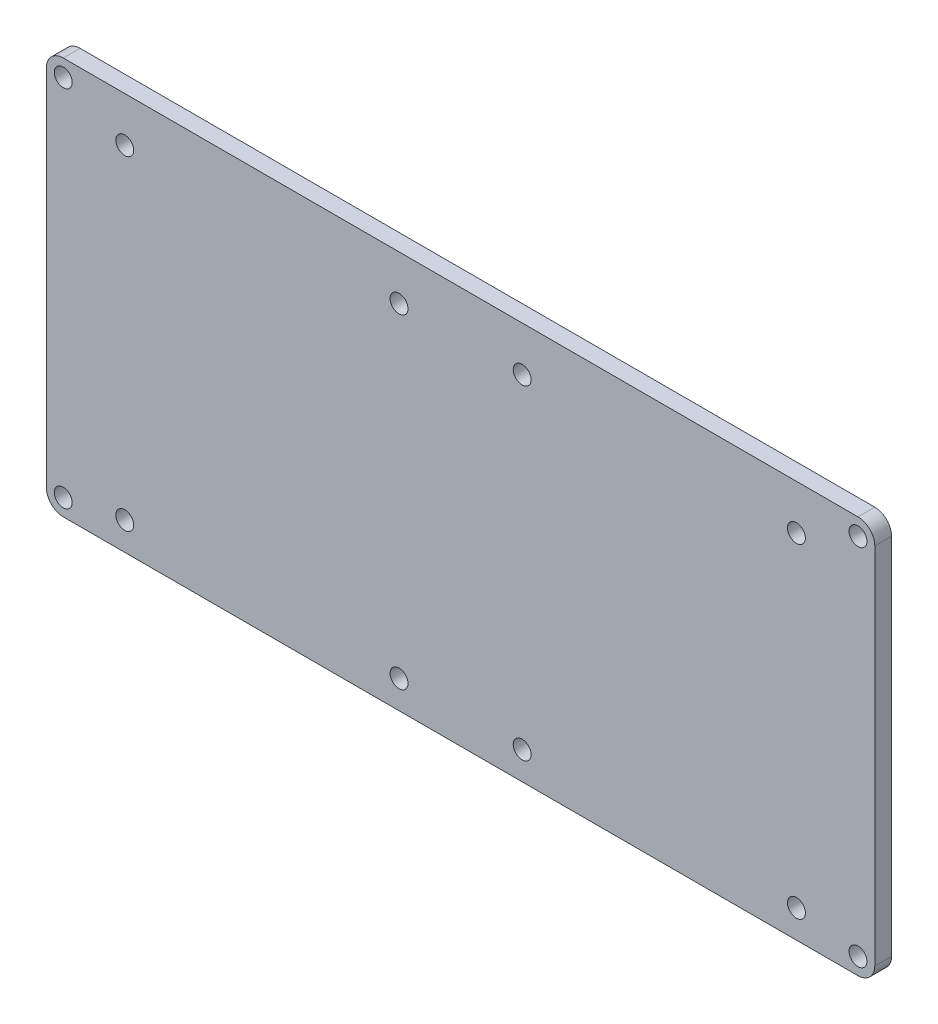
ISO-10303-21;
HEADER;
FILE_DESCRIPTION(('STEP AP214'),'2;1');
FILE_NAME('part.step','',(''),(''),'','','');
FILE_SCHEMA(('AUTOMOTIVE_DESIGN { 1 0 10303 214 1 1 1 1 }'));
ENDSEC;
DATA;
#1=APPLICATION_CONTEXT('core data for automotive mechanical design processes');
#2=APPLICATION_PROTOCOL_DEFINITION('international standard','automotive_design',2000,#1);
#3=PRODUCT_CONTEXT('',#1,'mechanical');
#4=PRODUCT('Part','Part','',(#3));
#5=PRODUCT_RELATED_PRODUCT_CATEGORY('part','',(#4));
#6=PRODUCT_DEFINITION_FORMATION('','',#4);
#7=PRODUCT_DEFINITION_CONTEXT('part definition',#1,'design');
#8=PRODUCT_DEFINITION('design','',#6,#7);
#9=PRODUCT_DEFINITION_SHAPE('','',#8);
#10=(LENGTH_UNIT() NAMED_UNIT(*) SI_UNIT(.MILLI.,.METRE.));
#11=(NAMED_UNIT(*) PLANE_ANGLE_UNIT() SI_UNIT($,.RADIAN.));
#12=(NAMED_UNIT(*) SI_UNIT($,.STERADIAN.) SOLID_ANGLE_UNIT());
#13=UNCERTAINTY_MEASURE_WITH_UNIT(LENGTH_MEASURE(1.E-05),#10,'distance_accuracy_value','');
#14=(GEOMETRIC_REPRESENTATION_CONTEXT(3) GLOBAL_UNCERTAINTY_ASSIGNED_CONTEXT((#13)) GLOBAL_UNIT_ASSIGNED_CONTEXT((#10,
#11,#12)) REPRESENTATION_CONTEXT('',''));
#15=CARTESIAN_POINT('',(0.,0.,0.));
#16=DIRECTION('',(0.,0.,1.));
#17=DIRECTION('',(1.,0.,0.));
#18=AXIS2_PLACEMENT_3D('',#15,#16,#17);
#19=CARTESIAN_POINT('',(3.,3.,3.));
#20=DIRECTION('',(0.,0.,1.));
#21=DIRECTION('',(1.,0.,0.));
#22=AXIS2_PLACEMENT_3D('',#19,#20,#21);
#23=PLANE('',#22);
#24=CARTESIAN_POINT('',(133.999999999999,5.,3.));
#25=DIRECTION('',(0.,0.,1.));
#26=DIRECTION('',(-1.,0.,0.));
#27=AXIS2_PLACEMENT_3D('',#24,#25,#26);
#28=CIRCLE('',#27,1.59999999999999);
#29=CARTESIAN_POINT('',(132.399999999999,5.,3.));
#30=VERTEX_POINT('',#29);
#31=EDGE_CURVE('E236',#30,#30,#28,.T.);
#32=ORIENTED_EDGE('',*,*,#31,.F.);
#33=EDGE_LOOP('',(#32));
#34=FACE_BOUND('',#33,.T.);
#35=CARTESIAN_POINT('',(85.,63.,3.));
#36=DIRECTION('',(0.,0.,1.));
#37=DIRECTION('',(-1.,0.,0.));
#38=AXIS2_PLACEMENT_3D('',#35,#36,#37);
#39=CIRCLE('',#38,1.60000000000001);
#40=CARTESIAN_POINT('',(83.4,63.,3.));
#41=VERTEX_POINT('',#40);
#42=EDGE_CURVE('E224',#41,#41,#39,.T.);
#43=ORIENTED_EDGE('',*,*,#42,.F.);
#44=EDGE_LOOP('',(#43));
#45=FACE_BOUND('',#44,.T.);
#46=CARTESIAN_POINT('',(63.0000000000006,5.,3.));
#47=DIRECTION('',(0.,0.,1.));
#48=DIRECTION('',(1.,0.,0.));
#49=AXIS2_PLACEMENT_3D('',#46,#47,#48);
#50=CIRCLE('',#49,1.60000000000001);
#51=CARTESIAN_POINT('',(64.6000000000006,5.,3.));
#52=VERTEX_POINT('',#51);
#53=EDGE_CURVE('E212',#52,#52,#50,.T.);
#54=ORIENTED_EDGE('',*,*,#53,.F.);
#55=EDGE_LOOP('',(#54));
#56=FACE_BOUND('',#55,.T.);
#57=CARTESIAN_POINT('',(2.99999999999978,68.,3.));
#58=DIRECTION('',(0.,0.,1.));
#59=DIRECTION('',(1.,0.,0.));
#60=AXIS2_PLACEMENT_3D('',#57,#58,#59);
#61=CIRCLE('',#60,1.6);
#62=CARTESIAN_POINT('',(4.59999999999977,68.,3.));
#63=VERTEX_POINT('',#62);
#64=EDGE_CURVE('E200',#63,#63,#61,.T.);
#65=ORIENTED_EDGE('',*,*,#64,.F.);
#66=EDGE_LOOP('',(#65));
#67=FACE_BOUND('',#66,.T.);
#68=CARTESIAN_POINT('',(145.,3.,3.));
#69=DIRECTION('',(0.,0.,1.));
#70=DIRECTION('',(1.,0.,0.));
#71=AXIS2_PLACEMENT_3D('',#68,#69,#70);
#72=CIRCLE('',#71,1.59999999999999);
#73=CARTESIAN_POINT('',(146.6,3.,3.));
#74=VERTEX_POINT('',#73);
#75=EDGE_CURVE('E188',#74,#74,#72,.T.);
#76=ORIENTED_EDGE('',*,*,#75,.F.);
#77=EDGE_LOOP('',(#76));
#78=FACE_BOUND('',#77,.T.);
#79=CARTESIAN_POINT('',(3.,3.,3.));
#80=DIRECTION('',(0.,0.,1.));
#81=DIRECTION('',(1.,0.,0.));
#82=AXIS2_PLACEMENT_3D('',#79,#80,#81);
#83=CIRCLE('',#82,1.6);
#84=CARTESIAN_POINT('',(4.6,3.,3.));
#85=VERTEX_POINT('',#84);
#86=EDGE_CURVE('E134',#85,#85,#83,.T.);
#87=ORIENTED_EDGE('',*,*,#86,.F.);
#88=EDGE_LOOP('',(#87));
#89=FACE_BOUND('',#88,.T.);
#90=CARTESIAN_POINT('',(3.,3.,3.));
#91=DIRECTION('',(0.,0.,1.));
#92=DIRECTION('',(1.,0.,0.));
#93=AXIS2_PLACEMENT_3D('',#90,#91,#92);
#94=CIRCLE('',#93,3.);
#95=CARTESIAN_POINT('',(0.,3.00000000000002,3.));
#96=VERTEX_POINT('',#95);
#97=CARTESIAN_POINT('',(3.00000000000002,0.,3.));
#98=VERTEX_POINT('',#97);
#99=EDGE_CURVE('E145',#96,#98,#94,.T.);
#100=ORIENTED_EDGE('',*,*,#99,.T.);
#101=DIRECTION('',(1.,0.,0.));
#102=VECTOR('',#101,1.);
#103=CARTESIAN_POINT('',(3.00000000000002,0.,3.));
#104=LINE('',#103,#102);
#105=CARTESIAN_POINT('',(145.,0.,3.));
#106=VERTEX_POINT('',#105);
#107=EDGE_CURVE('E93',#98,#106,#104,.T.);
#108=ORIENTED_EDGE('',*,*,#107,.T.);
#109=CARTESIAN_POINT('',(145.,3.,3.));
#110=DIRECTION('',(0.,0.,1.));
#111=DIRECTION('',(1.,0.,0.));
#112=AXIS2_PLACEMENT_3D('',#109,#110,#111);
#113=CIRCLE('',#112,3.);
#114=CARTESIAN_POINT('',(148.,3.00000000000002,3.));
#115=VERTEX_POINT('',#114);
#116=EDGE_CURVE('E160',#106,#115,#113,.T.);
#117=ORIENTED_EDGE('',*,*,#116,.T.);
#118=DIRECTION('',(0.,1.,0.));
#119=VECTOR('',#118,1.);
#120=CARTESIAN_POINT('',(148.,3.00000000000002,3.));
#121=LINE('',#120,#119);
#122=CARTESIAN_POINT('',(148.,68.,3.));
#123=VERTEX_POINT('',#122);
#124=EDGE_CURVE('E173',#115,#123,#121,.T.);
#125=ORIENTED_EDGE('',*,*,#124,.T.);
#126=CARTESIAN_POINT('',(145.,68.,3.));
#127=DIRECTION('',(0.,0.,1.));
#128=DIRECTION('',(1.,0.,0.));
#129=AXIS2_PLACEMENT_3D('',#126,#127,#128);
#130=CIRCLE('',#129,3.);
#131=CARTESIAN_POINT('',(145.,71.,3.));
#132=VERTEX_POINT('',#131);
#133=EDGE_CURVE('E112',#123,#132,#130,.T.);
#134=ORIENTED_EDGE('',*,*,#133,.T.);
#135=DIRECTION('',(-1.,0.,0.));
#136=VECTOR('',#135,1.);
#137=CARTESIAN_POINT('',(3.00000000000002,71.,3.));
#138=LINE('',#137,#136);
#139=CARTESIAN_POINT('',(3.00000000000002,71.,3.));
#140=VERTEX_POINT('',#139);
#141=EDGE_CURVE('E106',#132,#140,#138,.T.);
#142=ORIENTED_EDGE('',*,*,#141,.T.);
#143=CARTESIAN_POINT('',(3.,68.,3.));
#144=DIRECTION('',(0.,0.,1.));
#145=DIRECTION('',(1.,0.,0.));
#146=AXIS2_PLACEMENT_3D('',#143,#144,#145);
#147=CIRCLE('',#146,3.);
#148=CARTESIAN_POINT('',(0.,68.,3.));
#149=VERTEX_POINT('',#148);
#150=EDGE_CURVE('E110',#140,#149,#147,.T.);
#151=ORIENTED_EDGE('',*,*,#150,.T.);
#152=DIRECTION('',(0.,-1.,0.));
#153=VECTOR('',#152,1.);
#154=CARTESIAN_POINT('',(0.,3.00000000000002,3.));
#155=LINE('',#154,#153);
#156=EDGE_CURVE('E50',#149,#96,#155,.T.);
#157=ORIENTED_EDGE('',*,*,#156,.T.);
#158=EDGE_LOOP('',(#100,#108,#117,#125,#134,#142,#151,#157));
#159=FACE_BOUND('',#158,.T.);
#160=CARTESIAN_POINT('',(14.,63.,3.));
#161=DIRECTION('',(0.,0.,1.));
#162=DIRECTION('',(1.,0.,0.));
#163=AXIS2_PLACEMENT_3D('',#160,#161,#162);
#164=CIRCLE('',#163,1.6);
#165=CARTESIAN_POINT('',(15.6,63.,3.));
#166=VERTEX_POINT('',#165);
#167=EDGE_CURVE('E182',#166,#166,#164,.T.);
#168=ORIENTED_EDGE('',*,*,#167,.F.);
#169=EDGE_LOOP('',(#168));
#170=FACE_BOUND('',#169,.T.);
#171=CARTESIAN_POINT('',(145.,68.,3.));
#172=DIRECTION('',(0.,0.,1.));
#173=DIRECTION('',(1.,0.,0.));
#174=AXIS2_PLACEMENT_3D('',#171,#172,#173);
#175=CIRCLE('',#174,1.59999999999999);
#176=CARTESIAN_POINT('',(146.6,68.,3.));
#177=VERTEX_POINT('',#176);
#178=EDGE_CURVE('E194',#177,#177,#175,.T.);
#179=ORIENTED_EDGE('',*,*,#178,.F.);
#180=EDGE_LOOP('',(#179));
#181=FACE_BOUND('',#180,.T.);
#182=CARTESIAN_POINT('',(63.,63.,3.));
#183=DIRECTION('',(0.,0.,1.));
#184=DIRECTION('',(1.,0.,0.));
#185=AXIS2_PLACEMENT_3D('',#182,#183,#184);
#186=CIRCLE('',#185,1.60000000000001);
#187=CARTESIAN_POINT('',(64.6,63.,3.));
#188=VERTEX_POINT('',#187);
#189=EDGE_CURVE('E206',#188,#188,#186,.T.);
#190=ORIENTED_EDGE('',*,*,#189,.F.);
#191=EDGE_LOOP('',(#190));
#192=FACE_BOUND('',#191,.T.);
#193=CARTESIAN_POINT('',(14.0000000000006,5.,3.));
#194=DIRECTION('',(0.,0.,1.));
#195=DIRECTION('',(1.,0.,0.));
#196=AXIS2_PLACEMENT_3D('',#193,#194,#195);
#197=CIRCLE('',#196,1.6);
#198=CARTESIAN_POINT('',(15.6000000000006,5.,3.));
#199=VERTEX_POINT('',#198);
#200=EDGE_CURVE('E218',#199,#199,#197,.T.);
#201=ORIENTED_EDGE('',*,*,#200,.F.);
#202=EDGE_LOOP('',(#201));
#203=FACE_BOUND('',#202,.T.);
#204=CARTESIAN_POINT('',(84.9999999999994,5.,3.));
#205=DIRECTION('',(0.,0.,1.));
#206=DIRECTION('',(-1.,0.,0.));
#207=AXIS2_PLACEMENT_3D('',#204,#205,#206);
#208=CIRCLE('',#207,1.60000000000001);
#209=CARTESIAN_POINT('',(83.3999999999994,5.,3.));
#210=VERTEX_POINT('',#209);
#211=EDGE_CURVE('E230',#210,#210,#208,.T.);
#212=ORIENTED_EDGE('',*,*,#211,.F.);
#213=EDGE_LOOP('',(#212));
#214=FACE_BOUND('',#213,.T.);
#215=CARTESIAN_POINT('',(134.,63.,3.));
#216=DIRECTION('',(0.,0.,1.));
#217=DIRECTION('',(-1.,0.,0.));
#218=AXIS2_PLACEMENT_3D('',#215,#216,#217);
#219=CIRCLE('',#218,1.60000000000002);
#220=CARTESIAN_POINT('',(132.4,63.,3.));
#221=VERTEX_POINT('',#220);
#222=EDGE_CURVE('E242',#221,#221,#219,.T.);
#223=ORIENTED_EDGE('',*,*,#222,.F.);
#224=EDGE_LOOP('',(#223));
#225=FACE_BOUND('',#224,.T.);
#226=ADVANCED_FACE('F33',(#34,#45,#56,#67,#78,#89,#159,#170,#181,#192,#203,#214,#225),#23,.T.);
#227=CARTESIAN_POINT('',(3.,3.,0.));
#228=DIRECTION('',(0.,0.,1.));
#229=DIRECTION('',(1.,0.,0.));
#230=AXIS2_PLACEMENT_3D('',#227,#228,#229);
#231=PLANE('',#230);
#232=CARTESIAN_POINT('',(3.,3.,0.));
#233=DIRECTION('',(0.,0.,1.));
#234=DIRECTION('',(1.,0.,0.));
#235=AXIS2_PLACEMENT_3D('',#232,#233,#234);
#236=CIRCLE('',#235,3.);
#237=CARTESIAN_POINT('',(0.,3.00000000000002,0.));
#238=VERTEX_POINT('',#237);
#239=CARTESIAN_POINT('',(3.00000000000002,0.,0.));
#240=VERTEX_POINT('',#239);
#241=EDGE_CURVE('E130',#238,#240,#236,.T.);
#242=ORIENTED_EDGE('',*,*,#241,.F.);
#243=DIRECTION('',(0.,-1.,0.));
#244=VECTOR('',#243,1.);
#245=CARTESIAN_POINT('',(0.,3.00000000000002,0.));
#246=LINE('',#245,#244);
#247=CARTESIAN_POINT('',(0.,68.,0.));
#248=VERTEX_POINT('',#247);
#249=EDGE_CURVE('E85',#248,#238,#246,.T.);
#250=ORIENTED_EDGE('',*,*,#249,.F.);
#251=CARTESIAN_POINT('',(3.,68.,0.));
#252=DIRECTION('',(0.,0.,1.));
#253=DIRECTION('',(1.,0.,0.));
#254=AXIS2_PLACEMENT_3D('',#251,#252,#253);
#255=CIRCLE('',#254,3.);
#256=CARTESIAN_POINT('',(3.00000000000002,71.,0.));
#257=VERTEX_POINT('',#256);
#258=EDGE_CURVE('E79',#257,#248,#255,.T.);
#259=ORIENTED_EDGE('',*,*,#258,.F.);
#260=DIRECTION('',(-1.,0.,0.));
#261=VECTOR('',#260,1.);
#262=CARTESIAN_POINT('',(3.00000000000002,71.,0.));
#263=LINE('',#262,#261);
#264=CARTESIAN_POINT('',(145.,71.,0.));
#265=VERTEX_POINT('',#264);
#266=EDGE_CURVE('E120',#265,#257,#263,.T.);
#267=ORIENTED_EDGE('',*,*,#266,.F.);
#268=CARTESIAN_POINT('',(145.,68.,0.));
#269=DIRECTION('',(0.,0.,1.));
#270=DIRECTION('',(1.,0.,0.));
#271=AXIS2_PLACEMENT_3D('',#268,#269,#270);
#272=CIRCLE('',#271,3.);
#273=CARTESIAN_POINT('',(148.,68.,0.));
#274=VERTEX_POINT('',#273);
#275=EDGE_CURVE('E140',#274,#265,#272,.T.);
#276=ORIENTED_EDGE('',*,*,#275,.F.);
#277=DIRECTION('',(0.,1.,0.));
#278=VECTOR('',#277,1.);
#279=CARTESIAN_POINT('',(148.,3.00000000000002,0.));
#280=LINE('',#279,#278);
#281=CARTESIAN_POINT('',(148.,3.00000000000002,0.));
#282=VERTEX_POINT('',#281);
#283=EDGE_CURVE('E138',#282,#274,#280,.T.);
#284=ORIENTED_EDGE('',*,*,#283,.F.);
#285=CARTESIAN_POINT('',(145.,3.,0.));
#286=DIRECTION('',(0.,0.,1.));
#287=DIRECTION('',(1.,0.,0.));
#288=AXIS2_PLACEMENT_3D('',#285,#286,#287);
#289=CIRCLE('',#288,3.);
#290=CARTESIAN_POINT('',(145.,0.,0.));
#291=VERTEX_POINT('',#290);
#292=EDGE_CURVE('E136',#291,#282,#289,.T.);
#293=ORIENTED_EDGE('',*,*,#292,.F.);
#294=DIRECTION('',(1.,0.,0.));
#295=VECTOR('',#294,1.);
#296=CARTESIAN_POINT('',(3.00000000000002,0.,0.));
#297=LINE('',#296,#295);
#298=EDGE_CURVE('E133',#240,#291,#297,.T.);
#299=ORIENTED_EDGE('',*,*,#298,.F.);
#300=EDGE_LOOP('',(#242,#250,#259,#267,#276,#284,#293,#299));
#301=FACE_BOUND('',#300,.T.);
#302=CARTESIAN_POINT('',(3.,3.,0.));
#303=DIRECTION('',(0.,0.,1.));
#304=DIRECTION('',(1.,0.,0.));
#305=AXIS2_PLACEMENT_3D('',#302,#303,#304);
#306=CIRCLE('',#305,1.6);
#307=CARTESIAN_POINT('',(4.6,3.,0.));
#308=VERTEX_POINT('',#307);
#309=EDGE_CURVE('E179',#308,#308,#306,.T.);
#310=ORIENTED_EDGE('',*,*,#309,.T.);
#311=EDGE_LOOP('',(#310));
#312=FACE_BOUND('',#311,.T.);
#313=CARTESIAN_POINT('',(14.,63.,0.));
#314=DIRECTION('',(0.,0.,1.));
#315=DIRECTION('',(1.,0.,0.));
#316=AXIS2_PLACEMENT_3D('',#313,#314,#315);
#317=CIRCLE('',#316,1.6);
#318=CARTESIAN_POINT('',(15.6,63.,0.));
#319=VERTEX_POINT('',#318);
#320=EDGE_CURVE('E185',#319,#319,#317,.T.);
#321=ORIENTED_EDGE('',*,*,#320,.T.);
#322=EDGE_LOOP('',(#321));
#323=FACE_BOUND('',#322,.T.);
#324=CARTESIAN_POINT('',(145.,3.,0.));
#325=DIRECTION('',(0.,0.,1.));
#326=DIRECTION('',(1.,0.,0.));
#327=AXIS2_PLACEMENT_3D('',#324,#325,#326);
#328=CIRCLE('',#327,1.59999999999999);
#329=CARTESIAN_POINT('',(146.6,3.,0.));
#330=VERTEX_POINT('',#329);
#331=EDGE_CURVE('E191',#330,#330,#328,.T.);
#332=ORIENTED_EDGE('',*,*,#331,.T.);
#333=EDGE_LOOP('',(#332));
#334=FACE_BOUND('',#333,.T.);
#335=CARTESIAN_POINT('',(145.,68.,0.));
#336=DIRECTION('',(0.,0.,1.));
#337=DIRECTION('',(1.,0.,0.));
#338=AXIS2_PLACEMENT_3D('',#335,#336,#337);
#339=CIRCLE('',#338,1.59999999999999);
#340=CARTESIAN_POINT('',(146.6,68.,0.));
#341=VERTEX_POINT('',#340);
#342=EDGE_CURVE('E197',#341,#341,#339,.T.);
#343=ORIENTED_EDGE('',*,*,#342,.T.);
#344=EDGE_LOOP('',(#343));
#345=FACE_BOUND('',#344,.T.);
#346=CARTESIAN_POINT('',(2.99999999999978,68.,0.));
#347=DIRECTION('',(0.,0.,1.));
#348=DIRECTION('',(1.,0.,0.));
#349=AXIS2_PLACEMENT_3D('',#346,#347,#348);
#350=CIRCLE('',#349,1.6);
#351=CARTESIAN_POINT('',(4.59999999999977,68.,0.));
#352=VERTEX_POINT('',#351);
#353=EDGE_CURVE('E203',#352,#352,#350,.T.);
#354=ORIENTED_EDGE('',*,*,#353,.T.);
#355=EDGE_LOOP('',(#354));
#356=FACE_BOUND('',#355,.T.);
#357=CARTESIAN_POINT('',(63.,63.,0.));
#358=DIRECTION('',(0.,0.,1.));
#359=DIRECTION('',(1.,0.,0.));
#360=AXIS2_PLACEMENT_3D('',#357,#358,#359);
#361=CIRCLE('',#360,1.60000000000001);
#362=CARTESIAN_POINT('',(64.6,63.,0.));
#363=VERTEX_POINT('',#362);
#364=EDGE_CURVE('E209',#363,#363,#361,.T.);
#365=ORIENTED_EDGE('',*,*,#364,.T.);
#366=EDGE_LOOP('',(#365));
#367=FACE_BOUND('',#366,.T.);
#368=CARTESIAN_POINT('',(63.0000000000006,5.,0.));
#369=DIRECTION('',(0.,0.,1.));
#370=DIRECTION('',(1.,0.,0.));
#371=AXIS2_PLACEMENT_3D('',#368,#369,#370);
#372=CIRCLE('',#371,1.60000000000001);
#373=CARTESIAN_POINT('',(64.6000000000006,5.,0.));
#374=VERTEX_POINT('',#373);
#375=EDGE_CURVE('E215',#374,#374,#372,.T.);
#376=ORIENTED_EDGE('',*,*,#375,.T.);
#377=EDGE_LOOP('',(#376));
#378=FACE_BOUND('',#377,.T.);
#379=CARTESIAN_POINT('',(14.0000000000006,5.,0.));
#380=DIRECTION('',(0.,0.,1.));
#381=DIRECTION('',(1.,0.,0.));
#382=AXIS2_PLACEMENT_3D('',#379,#380,#381);
#383=CIRCLE('',#382,1.6);
#384=CARTESIAN_POINT('',(15.6000000000006,5.,0.));
#385=VERTEX_POINT('',#384);
#386=EDGE_CURVE('E221',#385,#385,#383,.T.);
#387=ORIENTED_EDGE('',*,*,#386,.T.);
#388=EDGE_LOOP('',(#387));
#389=FACE_BOUND('',#388,.T.);
#390=CARTESIAN_POINT('',(85.,63.,0.));
#391=DIRECTION('',(0.,0.,1.));
#392=DIRECTION('',(-1.,0.,0.));
#393=AXIS2_PLACEMENT_3D('',#390,#391,#392);
#394=CIRCLE('',#393,1.60000000000001);
#395=CARTESIAN_POINT('',(83.4,63.,0.));
#396=VERTEX_POINT('',#395);
#397=EDGE_CURVE('E227',#396,#396,#394,.T.);
#398=ORIENTED_EDGE('',*,*,#397,.T.);
#399=EDGE_LOOP('',(#398));
#400=FACE_BOUND('',#399,.T.);
#401=CARTESIAN_POINT('',(84.9999999999994,5.,0.));
#402=DIRECTION('',(0.,0.,1.));
#403=DIRECTION('',(-1.,0.,0.));
#404=AXIS2_PLACEMENT_3D('',#401,#402,#403);
#405=CIRCLE('',#404,1.60000000000001);
#406=CARTESIAN_POINT('',(83.3999999999994,5.,0.));
#407=VERTEX_POINT('',#406);
#408=EDGE_CURVE('E233',#407,#407,#405,.T.);
#409=ORIENTED_EDGE('',*,*,#408,.T.);
#410=EDGE_LOOP('',(#409));
#411=FACE_BOUND('',#410,.T.);
#412=CARTESIAN_POINT('',(133.999999999999,5.,0.));
#413=DIRECTION('',(0.,0.,1.));
#414=DIRECTION('',(-1.,0.,0.));
#415=AXIS2_PLACEMENT_3D('',#412,#413,#414);
#416=CIRCLE('',#415,1.59999999999999);
#417=CARTESIAN_POINT('',(132.399999999999,5.,0.));
#418=VERTEX_POINT('',#417);
#419=EDGE_CURVE('E239',#418,#418,#416,.T.);
#420=ORIENTED_EDGE('',*,*,#419,.T.);
#421=EDGE_LOOP('',(#420));
#422=FACE_BOUND('',#421,.T.);
#423=CARTESIAN_POINT('',(134.,63.,0.));
#424=DIRECTION('',(0.,0.,1.));
#425=DIRECTION('',(-1.,0.,0.));
#426=AXIS2_PLACEMENT_3D('',#423,#424,#425);
#427=CIRCLE('',#426,1.60000000000002);
#428=CARTESIAN_POINT('',(132.4,63.,0.));
#429=VERTEX_POINT('',#428);
#430=EDGE_CURVE('E245',#429,#429,#427,.T.);
#431=ORIENTED_EDGE('',*,*,#430,.T.);
#432=EDGE_LOOP('',(#431));
#433=FACE_BOUND('',#432,.T.);
#434=ADVANCED_FACE('F164',(#301,#312,#323,#334,#345,#356,#367,#378,#389,#400,#411,#422,#433),
#231,.F.);
#435=CARTESIAN_POINT('',(3.,3.,3.));
#436=DIRECTION('',(0.,0.,-1.));
#437=DIRECTION('',(-1.,0.,0.));
#438=AXIS2_PLACEMENT_3D('',#435,#436,#437);
#439=CYLINDRICAL_SURFACE('',#438,3.);
#440=ORIENTED_EDGE('',*,*,#241,.T.);
#441=DIRECTION('',(0.,0.,-1.));
#442=VECTOR('',#441,1.);
#443=CARTESIAN_POINT('',(3.00000000000002,0.,3.));
#444=LINE('',#443,#442);
#445=EDGE_CURVE('E11',#98,#240,#444,.T.);
#446=ORIENTED_EDGE('',*,*,#445,.F.);
#447=ORIENTED_EDGE('',*,*,#99,.F.);
#448=DIRECTION('',(0.,0.,-1.));
#449=VECTOR('',#448,1.);
#450=CARTESIAN_POINT('',(0.,3.00000000000002,3.));
#451=LINE('',#450,#449);
#452=EDGE_CURVE('E126',#96,#238,#451,.T.);
#453=ORIENTED_EDGE('',*,*,#452,.T.);
#454=EDGE_LOOP('',(#440,#446,#447,#453));
#455=FACE_BOUND('',#454,.T.);
#456=ADVANCED_FACE('F35',(#455),#439,.T.);
#457=CARTESIAN_POINT('',(3.00000000000002,0.,3.));
#458=DIRECTION('',(0.,1.,0.));
#459=DIRECTION('',(0.,0.,1.));
#460=AXIS2_PLACEMENT_3D('',#457,#458,#459);
#461=PLANE('',#460);
#462=ORIENTED_EDGE('',*,*,#298,.T.);
#463=DIRECTION('',(0.,0.,-1.));
#464=VECTOR('',#463,1.);
#465=CARTESIAN_POINT('',(145.,0.,3.));
#466=LINE('',#465,#464);
#467=EDGE_CURVE('E42',#106,#291,#466,.T.);
#468=ORIENTED_EDGE('',*,*,#467,.F.);
#469=ORIENTED_EDGE('',*,*,#107,.F.);
#470=ORIENTED_EDGE('',*,*,#445,.T.);
#471=EDGE_LOOP('',(#462,#468,#469,#470));
#472=FACE_BOUND('',#471,.T.);
#473=ADVANCED_FACE('F279',(#472),#461,.F.);
#474=CARTESIAN_POINT('',(145.,3.,3.));
#475=DIRECTION('',(0.,0.,-1.));
#476=DIRECTION('',(-1.,0.,0.));
#477=AXIS2_PLACEMENT_3D('',#474,#475,#476);
#478=CYLINDRICAL_SURFACE('',#477,3.);
#479=ORIENTED_EDGE('',*,*,#292,.T.);
#480=DIRECTION('',(0.,0.,-1.));
#481=VECTOR('',#480,1.);
#482=CARTESIAN_POINT('',(148.,3.00000000000002,3.));
#483=LINE('',#482,#481);
#484=EDGE_CURVE('E152',#115,#282,#483,.T.);
#485=ORIENTED_EDGE('',*,*,#484,.F.);
#486=ORIENTED_EDGE('',*,*,#116,.F.);
#487=ORIENTED_EDGE('',*,*,#467,.T.);
#488=EDGE_LOOP('',(#479,#485,#486,#487));
#489=FACE_BOUND('',#488,.T.);
#490=ADVANCED_FACE('F158',(#489),#478,.T.);
#491=CARTESIAN_POINT('',(148.,3.00000000000002,3.));
#492=DIRECTION('',(-1.,0.,0.));
#493=DIRECTION('',(0.,0.,1.));
#494=AXIS2_PLACEMENT_3D('',#491,#492,#493);
#495=PLANE('',#494);
#496=ORIENTED_EDGE('',*,*,#283,.T.);
#497=DIRECTION('',(0.,0.,-1.));
#498=VECTOR('',#497,1.);
#499=CARTESIAN_POINT('',(148.,68.,3.));
#500=LINE('',#499,#498);
#501=EDGE_CURVE('E149',#123,#274,#500,.T.);
#502=ORIENTED_EDGE('',*,*,#501,.F.);
#503=ORIENTED_EDGE('',*,*,#124,.F.);
#504=ORIENTED_EDGE('',*,*,#484,.T.);
#505=EDGE_LOOP('',(#496,#502,#503,#504));
#506=FACE_BOUND('',#505,.T.);
#507=ADVANCED_FACE('F169',(#506),#495,.F.);
#508=CARTESIAN_POINT('',(145.,68.,3.));
#509=DIRECTION('',(0.,0.,-1.));
#510=DIRECTION('',(-1.,0.,0.));
#511=AXIS2_PLACEMENT_3D('',#508,#509,#510);
#512=CYLINDRICAL_SURFACE('',#511,3.);
#513=ORIENTED_EDGE('',*,*,#275,.T.);
#514=DIRECTION('',(0.,0.,-1.));
#515=VECTOR('',#514,1.);
#516=CARTESIAN_POINT('',(145.,71.,3.));
#517=LINE('',#516,#515);
#518=EDGE_CURVE('E121',#132,#265,#517,.T.);
#519=ORIENTED_EDGE('',*,*,#518,.F.);
#520=ORIENTED_EDGE('',*,*,#133,.F.);
#521=ORIENTED_EDGE('',*,*,#501,.T.);
#522=EDGE_LOOP('',(#513,#519,#520,#521));
#523=FACE_BOUND('',#522,.T.);
#524=ADVANCED_FACE('F172',(#523),#512,.T.);
#525=CARTESIAN_POINT('',(3.00000000000002,71.,3.));
#526=DIRECTION('',(0.,-1.,0.));
#527=DIRECTION('',(0.,0.,-1.));
#528=AXIS2_PLACEMENT_3D('',#525,#526,#527);
#529=PLANE('',#528);
#530=ORIENTED_EDGE('',*,*,#266,.T.);
#531=DIRECTION('',(0.,0.,-1.));
#532=VECTOR('',#531,1.);
#533=CARTESIAN_POINT('',(3.00000000000002,71.,3.));
#534=LINE('',#533,#532);
#535=EDGE_CURVE('E117',#140,#257,#534,.T.);
#536=ORIENTED_EDGE('',*,*,#535,.F.);
#537=ORIENTED_EDGE('',*,*,#141,.F.);
#538=ORIENTED_EDGE('',*,*,#518,.T.);
#539=EDGE_LOOP('',(#530,#536,#537,#538));
#540=FACE_BOUND('',#539,.T.);
#541=ADVANCED_FACE('F118',(#540),#529,.F.);
#542=CARTESIAN_POINT('',(3.,68.,3.));
#543=DIRECTION('',(0.,0.,-1.));
#544=DIRECTION('',(-1.,0.,0.));
#545=AXIS2_PLACEMENT_3D('',#542,#543,#544);
#546=CYLINDRICAL_SURFACE('',#545,3.);
#547=ORIENTED_EDGE('',*,*,#258,.T.);
#548=DIRECTION('',(0.,0.,-1.));
#549=VECTOR('',#548,1.);
#550=CARTESIAN_POINT('',(0.,68.,3.));
#551=LINE('',#550,#549);
#552=EDGE_CURVE('E122',#149,#248,#551,.T.);
#553=ORIENTED_EDGE('',*,*,#552,.F.);
#554=ORIENTED_EDGE('',*,*,#150,.F.);
#555=ORIENTED_EDGE('',*,*,#535,.T.);
#556=EDGE_LOOP('',(#547,#553,#554,#555));
#557=FACE_BOUND('',#556,.T.);
#558=ADVANCED_FACE('F124',(#557),#546,.T.);
#559=CARTESIAN_POINT('',(0.,3.00000000000002,3.));
#560=DIRECTION('',(1.,0.,0.));
#561=DIRECTION('',(0.,0.,-1.));
#562=AXIS2_PLACEMENT_3D('',#559,#560,#561);
#563=PLANE('',#562);
#564=ORIENTED_EDGE('',*,*,#249,.T.);
#565=ORIENTED_EDGE('',*,*,#452,.F.);
#566=ORIENTED_EDGE('',*,*,#156,.F.);
#567=ORIENTED_EDGE('',*,*,#552,.T.);
#568=EDGE_LOOP('',(#564,#565,#566,#567));
#569=FACE_BOUND('',#568,.T.);
#570=ADVANCED_FACE('F267',(#569),#563,.F.);
#571=CARTESIAN_POINT('',(3.,3.,3.));
#572=DIRECTION('',(0.,0.,-1.));
#573=DIRECTION('',(-1.,0.,0.));
#574=AXIS2_PLACEMENT_3D('',#571,#572,#573);
#575=CYLINDRICAL_SURFACE('',#574,1.6);
#576=ORIENTED_EDGE('',*,*,#86,.T.);
#577=EDGE_LOOP('',(#576));
#578=FACE_BOUND('',#577,.T.);
#579=ORIENTED_EDGE('',*,*,#309,.F.);
#580=EDGE_LOOP('',(#579));
#581=FACE_BOUND('',#580,.T.);
#582=ADVANCED_FACE('F264',(#578,#581),#575,.F.);
#583=CARTESIAN_POINT('',(14.,63.,3.));
#584=DIRECTION('',(0.,0.,-1.));
#585=DIRECTION('',(-1.,0.,0.));
#586=AXIS2_PLACEMENT_3D('',#583,#584,#585);
#587=CYLINDRICAL_SURFACE('',#586,1.6);
#588=ORIENTED_EDGE('',*,*,#167,.T.);
#589=EDGE_LOOP('',(#588));
#590=FACE_BOUND('',#589,.T.);
#591=ORIENTED_EDGE('',*,*,#320,.F.);
#592=EDGE_LOOP('',(#591));
#593=FACE_BOUND('',#592,.T.);
#594=ADVANCED_FACE('F343',(#590,#593),#587,.F.);
#595=CARTESIAN_POINT('',(145.,3.,3.));
#596=DIRECTION('',(0.,0.,-1.));
#597=DIRECTION('',(-1.,0.,0.));
#598=AXIS2_PLACEMENT_3D('',#595,#596,#597);
#599=CYLINDRICAL_SURFACE('',#598,1.59999999999999);
#600=ORIENTED_EDGE('',*,*,#75,.T.);
#601=EDGE_LOOP('',(#600));
#602=FACE_BOUND('',#601,.T.);
#603=ORIENTED_EDGE('',*,*,#331,.F.);
#604=EDGE_LOOP('',(#603));
#605=FACE_BOUND('',#604,.T.);
#606=ADVANCED_FACE('F351',(#602,#605),#599,.F.);
#607=CARTESIAN_POINT('',(145.,68.,3.));
#608=DIRECTION('',(0.,0.,-1.));
#609=DIRECTION('',(-1.,0.,0.));
#610=AXIS2_PLACEMENT_3D('',#607,#608,#609);
#611=CYLINDRICAL_SURFACE('',#610,1.59999999999999);
#612=ORIENTED_EDGE('',*,*,#178,.T.);
#613=EDGE_LOOP('',(#612));
#614=FACE_BOUND('',#613,.T.);
#615=ORIENTED_EDGE('',*,*,#342,.F.);
#616=EDGE_LOOP('',(#615));
#617=FACE_BOUND('',#616,.T.);
#618=ADVANCED_FACE('F359',(#614,#617),#611,.F.);
#619=CARTESIAN_POINT('',(2.99999999999978,68.,3.));
#620=DIRECTION('',(0.,0.,-1.));
#621=DIRECTION('',(-1.,0.,0.));
#622=AXIS2_PLACEMENT_3D('',#619,#620,#621);
#623=CYLINDRICAL_SURFACE('',#622,1.6);
#624=ORIENTED_EDGE('',*,*,#64,.T.);
#625=EDGE_LOOP('',(#624));
#626=FACE_BOUND('',#625,.T.);
#627=ORIENTED_EDGE('',*,*,#353,.F.);
#628=EDGE_LOOP('',(#627));
#629=FACE_BOUND('',#628,.T.);
#630=ADVANCED_FACE('F368',(#626,#629),#623,.F.);
#631=CARTESIAN_POINT('',(63.,63.,3.));
#632=DIRECTION('',(0.,0.,-1.));
#633=DIRECTION('',(-1.,0.,0.));
#634=AXIS2_PLACEMENT_3D('',#631,#632,#633);
#635=CYLINDRICAL_SURFACE('',#634,1.60000000000001);
#636=ORIENTED_EDGE('',*,*,#189,.T.);
#637=EDGE_LOOP('',(#636));
#638=FACE_BOUND('',#637,.T.);
#639=ORIENTED_EDGE('',*,*,#364,.F.);
#640=EDGE_LOOP('',(#639));
#641=FACE_BOUND('',#640,.T.);
#642=ADVANCED_FACE('F377',(#638,#641),#635,.F.);
#643=CARTESIAN_POINT('',(63.0000000000006,5.,3.));
#644=DIRECTION('',(0.,0.,-1.));
#645=DIRECTION('',(-1.,0.,0.));
#646=AXIS2_PLACEMENT_3D('',#643,#644,#645);
#647=CYLINDRICAL_SURFACE('',#646,1.60000000000001);
#648=ORIENTED_EDGE('',*,*,#53,.T.);
#649=EDGE_LOOP('',(#648));
#650=FACE_BOUND('',#649,.T.);
#651=ORIENTED_EDGE('',*,*,#375,.F.);
#652=EDGE_LOOP('',(#651));
#653=FACE_BOUND('',#652,.T.);
#654=ADVANCED_FACE('F386',(#650,#653),#647,.F.);
#655=CARTESIAN_POINT('',(14.0000000000006,5.,3.));
#656=DIRECTION('',(0.,0.,-1.));
#657=DIRECTION('',(-1.,0.,0.));
#658=AXIS2_PLACEMENT_3D('',#655,#656,#657);
#659=CYLINDRICAL_SURFACE('',#658,1.6);
#660=ORIENTED_EDGE('',*,*,#200,.T.);
#661=EDGE_LOOP('',(#660));
#662=FACE_BOUND('',#661,.T.);
#663=ORIENTED_EDGE('',*,*,#386,.F.);
#664=EDGE_LOOP('',(#663));
#665=FACE_BOUND('',#664,.T.);
#666=ADVANCED_FACE('F395',(#662,#665),#659,.F.);
#667=CARTESIAN_POINT('',(85.,63.,3.));
#668=DIRECTION('',(0.,0.,-1.));
#669=DIRECTION('',(-1.,0.,0.));
#670=AXIS2_PLACEMENT_3D('',#667,#668,#669);
#671=CYLINDRICAL_SURFACE('',#670,1.60000000000001);
#672=ORIENTED_EDGE('',*,*,#42,.T.);
#673=EDGE_LOOP('',(#672));
#674=FACE_BOUND('',#673,.T.);
#675=ORIENTED_EDGE('',*,*,#397,.F.);
#676=EDGE_LOOP('',(#675));
#677=FACE_BOUND('',#676,.T.);
#678=ADVANCED_FACE('F404',(#674,#677),#671,.F.);
#679=CARTESIAN_POINT('',(84.9999999999994,5.,3.));
#680=DIRECTION('',(0.,0.,-1.));
#681=DIRECTION('',(-1.,0.,0.));
#682=AXIS2_PLACEMENT_3D('',#679,#680,#681);
#683=CYLINDRICAL_SURFACE('',#682,1.60000000000001);
#684=ORIENTED_EDGE('',*,*,#211,.T.);
#685=EDGE_LOOP('',(#684));
#686=FACE_BOUND('',#685,.T.);
#687=ORIENTED_EDGE('',*,*,#408,.F.);
#688=EDGE_LOOP('',(#687));
#689=FACE_BOUND('',#688,.T.);
#690=ADVANCED_FACE('F413',(#686,#689),#683,.F.);
#691=CARTESIAN_POINT('',(133.999999999999,5.,3.));
#692=DIRECTION('',(0.,0.,-1.));
#693=DIRECTION('',(-1.,0.,0.));
#694=AXIS2_PLACEMENT_3D('',#691,#692,#693);
#695=CYLINDRICAL_SURFACE('',#694,1.59999999999999);
#696=ORIENTED_EDGE('',*,*,#31,.T.);
#697=EDGE_LOOP('',(#696));
#698=FACE_BOUND('',#697,.T.);
#699=ORIENTED_EDGE('',*,*,#419,.F.);
#700=EDGE_LOOP('',(#699));
#701=FACE_BOUND('',#700,.T.);
#702=ADVANCED_FACE('F422',(#698,#701),#695,.F.);
#703=CARTESIAN_POINT('',(134.,63.,3.));
#704=DIRECTION('',(0.,0.,-1.));
#705=DIRECTION('',(-1.,0.,0.));
#706=AXIS2_PLACEMENT_3D('',#703,#704,#705);
#707=CYLINDRICAL_SURFACE('',#706,1.60000000000002);
#708=ORIENTED_EDGE('',*,*,#222,.T.);
#709=EDGE_LOOP('',(#708));
#710=FACE_BOUND('',#709,.T.);
#711=ORIENTED_EDGE('',*,*,#430,.F.);
#712=EDGE_LOOP('',(#711));
#713=FACE_BOUND('',#712,.T.);
#714=ADVANCED_FACE('F251',(#710,#713),#707,.F.);
#715=CLOSED_SHELL('',(#226,#434,#456,#473,#490,#507,#524,#541,#558,#570,#582,#594,#606,#618,
#630,#642,#654,#666,#678,#690,#702,#714));
#716=MANIFOLD_SOLID_BREP('B2',#715);
#717=ADVANCED_BREP_SHAPE_REPRESENTATION('',(#18,#716),#14);
#718=SHAPE_DEFINITION_REPRESENTATION(#9,#717);
ENDSEC;
END-ISO-10303-21;
